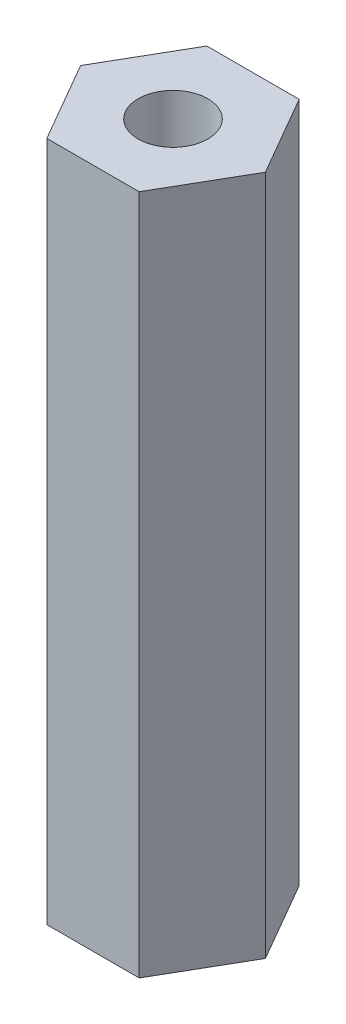
ISO-10303-21;
HEADER;
FILE_DESCRIPTION(('STEP AP214'),'2;1');
FILE_NAME('part.step','',(''),(''),'','','');
FILE_SCHEMA(('AUTOMOTIVE_DESIGN { 1 0 10303 214 1 1 1 1 }'));
ENDSEC;
DATA;
#1=APPLICATION_CONTEXT('core data for automotive mechanical design processes');
#2=APPLICATION_PROTOCOL_DEFINITION('international standard','automotive_design',2000,#1);
#3=PRODUCT_CONTEXT('',#1,'mechanical');
#4=PRODUCT('Part','Part','',(#3));
#5=PRODUCT_RELATED_PRODUCT_CATEGORY('part','',(#4));
#6=PRODUCT_DEFINITION_FORMATION('','',#4);
#7=PRODUCT_DEFINITION_CONTEXT('part definition',#1,'design');
#8=PRODUCT_DEFINITION('design','',#6,#7);
#9=PRODUCT_DEFINITION_SHAPE('','',#8);
#10=(LENGTH_UNIT() NAMED_UNIT(*) SI_UNIT(.MILLI.,.METRE.));
#11=(NAMED_UNIT(*) PLANE_ANGLE_UNIT() SI_UNIT($,.RADIAN.));
#12=(NAMED_UNIT(*) SI_UNIT($,.STERADIAN.) SOLID_ANGLE_UNIT());
#13=UNCERTAINTY_MEASURE_WITH_UNIT(LENGTH_MEASURE(1.E-05),#10,'distance_accuracy_value','');
#14=(GEOMETRIC_REPRESENTATION_CONTEXT(3) GLOBAL_UNCERTAINTY_ASSIGNED_CONTEXT((#13)) GLOBAL_UNIT_ASSIGNED_CONTEXT((#10,
#11,#12)) REPRESENTATION_CONTEXT('',''));
#15=CARTESIAN_POINT('',(0.,0.,0.));
#16=DIRECTION('',(0.,0.,1.));
#17=DIRECTION('',(1.,0.,0.));
#18=AXIS2_PLACEMENT_3D('',#15,#16,#17);
#19=CARTESIAN_POINT('',(-1.35677313259562,0.,2.35));
#20=DIRECTION('',(0.,0.,1.));
#21=DIRECTION('',(1.,0.,0.));
#22=AXIS2_PLACEMENT_3D('',#19,#20,#21);
#23=PLANE('',#22);
#24=DIRECTION('',(1.,0.,0.));
#25=VECTOR('',#24,1.);
#26=CARTESIAN_POINT('',(-1.35677313259562,20.,2.35));
#27=LINE('',#26,#25);
#28=CARTESIAN_POINT('',(-1.35677313259562,20.,2.35));
#29=VERTEX_POINT('',#28);
#30=CARTESIAN_POINT('',(1.35677313259562,20.,2.35));
#31=VERTEX_POINT('',#30);
#32=EDGE_CURVE('E118',#29,#31,#27,.T.);
#33=ORIENTED_EDGE('',*,*,#32,.F.);
#34=DIRECTION('',(0.,1.,0.));
#35=VECTOR('',#34,1.);
#36=CARTESIAN_POINT('',(-1.35677313259562,0.,2.35));
#37=LINE('',#36,#35);
#38=CARTESIAN_POINT('',(-1.35677313259562,0.,2.35));
#39=VERTEX_POINT('',#38);
#40=EDGE_CURVE('E11',#39,#29,#37,.T.);
#41=ORIENTED_EDGE('',*,*,#40,.F.);
#42=DIRECTION('',(1.,0.,0.));
#43=VECTOR('',#42,1.);
#44=CARTESIAN_POINT('',(-1.35677313259562,0.,2.35));
#45=LINE('',#44,#43);
#46=CARTESIAN_POINT('',(1.35677313259562,0.,2.35));
#47=VERTEX_POINT('',#46);
#48=EDGE_CURVE('E133',#39,#47,#45,.T.);
#49=ORIENTED_EDGE('',*,*,#48,.T.);
#50=DIRECTION('',(0.,1.,0.));
#51=VECTOR('',#50,1.);
#52=CARTESIAN_POINT('',(1.35677313259562,0.,2.35));
#53=LINE('',#52,#51);
#54=EDGE_CURVE('E36',#47,#31,#53,.T.);
#55=ORIENTED_EDGE('',*,*,#54,.T.);
#56=EDGE_LOOP('',(#33,#41,#49,#55));
#57=FACE_BOUND('',#56,.T.);
#58=ADVANCED_FACE('F33',(#57),#23,.T.);
#59=CARTESIAN_POINT('',(-2.71354626519124,0.,0.));
#60=DIRECTION('',(-0.866025403784439,0.,0.5));
#61=DIRECTION('',(0.5,0.,0.866025403784439));
#62=AXIS2_PLACEMENT_3D('',#59,#60,#61);
#63=PLANE('',#62);
#64=DIRECTION('',(0.5,0.,0.866025403784438));
#65=VECTOR('',#64,1.);
#66=CARTESIAN_POINT('',(-2.71354626519124,20.,0.));
#67=LINE('',#66,#65);
#68=CARTESIAN_POINT('',(-2.71354626519124,20.,0.));
#69=VERTEX_POINT('',#68);
#70=EDGE_CURVE('E131',#69,#29,#67,.T.);
#71=ORIENTED_EDGE('',*,*,#70,.F.);
#72=DIRECTION('',(0.,1.,0.));
#73=VECTOR('',#72,1.);
#74=CARTESIAN_POINT('',(-2.71354626519124,0.,0.));
#75=LINE('',#74,#73);
#76=CARTESIAN_POINT('',(-2.71354626519124,0.,0.));
#77=VERTEX_POINT('',#76);
#78=EDGE_CURVE('E42',#77,#69,#75,.T.);
#79=ORIENTED_EDGE('',*,*,#78,.F.);
#80=DIRECTION('',(0.5,0.,0.866025403784438));
#81=VECTOR('',#80,1.);
#82=CARTESIAN_POINT('',(-2.71354626519124,0.,0.));
#83=LINE('',#82,#81);
#84=EDGE_CURVE('E108',#77,#39,#83,.T.);
#85=ORIENTED_EDGE('',*,*,#84,.T.);
#86=ORIENTED_EDGE('',*,*,#40,.T.);
#87=EDGE_LOOP('',(#71,#79,#85,#86));
#88=FACE_BOUND('',#87,.T.);
#89=ADVANCED_FACE('F141',(#88),#63,.T.);
#90=CARTESIAN_POINT('',(-1.35677313259562,0.,-2.35));
#91=DIRECTION('',(-0.866025403784438,0.,-0.5));
#92=DIRECTION('',(-0.5,0.,0.866025403784438));
#93=AXIS2_PLACEMENT_3D('',#90,#91,#92);
#94=PLANE('',#93);
#95=DIRECTION('',(-0.5,0.,0.866025403784438));
#96=VECTOR('',#95,1.);
#97=CARTESIAN_POINT('',(-1.35677313259562,20.,-2.35));
#98=LINE('',#97,#96);
#99=CARTESIAN_POINT('',(-1.35677313259562,20.,-2.35));
#100=VERTEX_POINT('',#99);
#101=EDGE_CURVE('E95',#100,#69,#98,.T.);
#102=ORIENTED_EDGE('',*,*,#101,.F.);
#103=DIRECTION('',(0.,1.,0.));
#104=VECTOR('',#103,1.);
#105=CARTESIAN_POINT('',(-1.35677313259562,0.,-2.35));
#106=LINE('',#105,#104);
#107=CARTESIAN_POINT('',(-1.35677313259562,0.,-2.35));
#108=VERTEX_POINT('',#107);
#109=EDGE_CURVE('E90',#108,#100,#106,.T.);
#110=ORIENTED_EDGE('',*,*,#109,.F.);
#111=DIRECTION('',(-0.5,0.,0.866025403784438));
#112=VECTOR('',#111,1.);
#113=CARTESIAN_POINT('',(-1.35677313259562,0.,-2.35));
#114=LINE('',#113,#112);
#115=EDGE_CURVE('E93',#108,#77,#114,.T.);
#116=ORIENTED_EDGE('',*,*,#115,.T.);
#117=ORIENTED_EDGE('',*,*,#78,.T.);
#118=EDGE_LOOP('',(#102,#110,#116,#117));
#119=FACE_BOUND('',#118,.T.);
#120=ADVANCED_FACE('F92',(#119),#94,.T.);
#121=CARTESIAN_POINT('',(1.35677313259562,0.,-2.35));
#122=DIRECTION('',(0.,0.,-1.));
#123=DIRECTION('',(-1.,0.,0.));
#124=AXIS2_PLACEMENT_3D('',#121,#122,#123);
#125=PLANE('',#124);
#126=DIRECTION('',(-1.,0.,0.));
#127=VECTOR('',#126,1.);
#128=CARTESIAN_POINT('',(1.35677313259562,20.,-2.35));
#129=LINE('',#128,#127);
#130=CARTESIAN_POINT('',(1.35677313259562,20.,-2.35));
#131=VERTEX_POINT('',#130);
#132=EDGE_CURVE('E128',#131,#100,#129,.T.);
#133=ORIENTED_EDGE('',*,*,#132,.F.);
#134=DIRECTION('',(0.,1.,0.));
#135=VECTOR('',#134,1.);
#136=CARTESIAN_POINT('',(1.35677313259562,0.,-2.35));
#137=LINE('',#136,#135);
#138=CARTESIAN_POINT('',(1.35677313259562,0.,-2.35));
#139=VERTEX_POINT('',#138);
#140=EDGE_CURVE('E100',#139,#131,#137,.T.);
#141=ORIENTED_EDGE('',*,*,#140,.F.);
#142=DIRECTION('',(-1.,0.,0.));
#143=VECTOR('',#142,1.);
#144=CARTESIAN_POINT('',(1.35677313259562,0.,-2.35));
#145=LINE('',#144,#143);
#146=EDGE_CURVE('E106',#139,#108,#145,.T.);
#147=ORIENTED_EDGE('',*,*,#146,.T.);
#148=ORIENTED_EDGE('',*,*,#109,.T.);
#149=EDGE_LOOP('',(#133,#141,#147,#148));
#150=FACE_BOUND('',#149,.T.);
#151=ADVANCED_FACE('F110',(#150),#125,.T.);
#152=CARTESIAN_POINT('',(2.71354626519124,0.,0.));
#153=DIRECTION('',(0.866025403784438,0.,-0.5));
#154=DIRECTION('',(-0.5,0.,-0.866025403784439));
#155=AXIS2_PLACEMENT_3D('',#152,#153,#154);
#156=PLANE('',#155);
#157=DIRECTION('',(-0.5,0.,-0.866025403784438));
#158=VECTOR('',#157,1.);
#159=CARTESIAN_POINT('',(2.71354626519124,20.,0.));
#160=LINE('',#159,#158);
#161=CARTESIAN_POINT('',(2.71354626519124,20.,0.));
#162=VERTEX_POINT('',#161);
#163=EDGE_CURVE('E125',#162,#131,#160,.T.);
#164=ORIENTED_EDGE('',*,*,#163,.F.);
#165=DIRECTION('',(0.,1.,0.));
#166=VECTOR('',#165,1.);
#167=CARTESIAN_POINT('',(2.71354626519124,0.,0.));
#168=LINE('',#167,#166);
#169=CARTESIAN_POINT('',(2.71354626519124,0.,0.));
#170=VERTEX_POINT('',#169);
#171=EDGE_CURVE('E136',#170,#162,#168,.T.);
#172=ORIENTED_EDGE('',*,*,#171,.F.);
#173=DIRECTION('',(-0.5,0.,-0.866025403784438));
#174=VECTOR('',#173,1.);
#175=CARTESIAN_POINT('',(2.71354626519124,0.,0.));
#176=LINE('',#175,#174);
#177=EDGE_CURVE('E111',#170,#139,#176,.T.);
#178=ORIENTED_EDGE('',*,*,#177,.T.);
#179=ORIENTED_EDGE('',*,*,#140,.T.);
#180=EDGE_LOOP('',(#164,#172,#178,#179));
#181=FACE_BOUND('',#180,.T.);
#182=ADVANCED_FACE('F154',(#181),#156,.T.);
#183=CARTESIAN_POINT('',(1.35677313259562,0.,2.35));
#184=DIRECTION('',(0.866025403784438,0.,0.5));
#185=DIRECTION('',(0.5,0.,-0.866025403784438));
#186=AXIS2_PLACEMENT_3D('',#183,#184,#185);
#187=PLANE('',#186);
#188=DIRECTION('',(0.5,0.,-0.866025403784438));
#189=VECTOR('',#188,1.);
#190=CARTESIAN_POINT('',(1.35677313259562,20.,2.35));
#191=LINE('',#190,#189);
#192=EDGE_CURVE('E121',#31,#162,#191,.T.);
#193=ORIENTED_EDGE('',*,*,#192,.F.);
#194=ORIENTED_EDGE('',*,*,#54,.F.);
#195=DIRECTION('',(0.5,0.,-0.866025403784438));
#196=VECTOR('',#195,1.);
#197=CARTESIAN_POINT('',(1.35677313259562,0.,2.35));
#198=LINE('',#197,#196);
#199=EDGE_CURVE('E113',#47,#170,#198,.T.);
#200=ORIENTED_EDGE('',*,*,#199,.T.);
#201=ORIENTED_EDGE('',*,*,#171,.T.);
#202=EDGE_LOOP('',(#193,#194,#200,#201));
#203=FACE_BOUND('',#202,.T.);
#204=ADVANCED_FACE('F138',(#203),#187,.T.);
#205=CARTESIAN_POINT('',(0.,0.,0.));
#206=DIRECTION('',(0.,1.,0.));
#207=DIRECTION('',(0.,0.,1.));
#208=AXIS2_PLACEMENT_3D('',#205,#206,#207);
#209=PLANE('',#208);
#210=CARTESIAN_POINT('',(0.,0.,0.));
#211=DIRECTION('',(0.,1.,0.));
#212=DIRECTION('',(0.,0.,1.));
#213=AXIS2_PLACEMENT_3D('',#210,#211,#212);
#214=CIRCLE('',#213,1.025);
#215=CARTESIAN_POINT('',(0.,0.,1.025));
#216=VERTEX_POINT('',#215);
#217=EDGE_CURVE('E122',#216,#216,#214,.T.);
#218=ORIENTED_EDGE('',*,*,#217,.T.);
#219=EDGE_LOOP('',(#218));
#220=FACE_BOUND('',#219,.T.);
#221=ORIENTED_EDGE('',*,*,#48,.F.);
#222=ORIENTED_EDGE('',*,*,#84,.F.);
#223=ORIENTED_EDGE('',*,*,#115,.F.);
#224=ORIENTED_EDGE('',*,*,#146,.F.);
#225=ORIENTED_EDGE('',*,*,#177,.F.);
#226=ORIENTED_EDGE('',*,*,#199,.F.);
#227=EDGE_LOOP('',(#221,#222,#223,#224,#225,#226));
#228=FACE_BOUND('',#227,.T.);
#229=ADVANCED_FACE('F104',(#220,#228),#209,.F.);
#230=CARTESIAN_POINT('',(0.,20.,0.));
#231=DIRECTION('',(0.,1.,0.));
#232=DIRECTION('',(0.,0.,1.));
#233=AXIS2_PLACEMENT_3D('',#230,#231,#232);
#234=PLANE('',#233);
#235=CARTESIAN_POINT('',(0.,20.,0.));
#236=DIRECTION('',(0.,1.,0.));
#237=DIRECTION('',(0.,0.,1.));
#238=AXIS2_PLACEMENT_3D('',#235,#236,#237);
#239=CIRCLE('',#238,1.025);
#240=CARTESIAN_POINT('',(0.,20.,1.025));
#241=VERTEX_POINT('',#240);
#242=EDGE_CURVE('E176',#241,#241,#239,.T.);
#243=ORIENTED_EDGE('',*,*,#242,.F.);
#244=EDGE_LOOP('',(#243));
#245=FACE_BOUND('',#244,.T.);
#246=ORIENTED_EDGE('',*,*,#32,.T.);
#247=ORIENTED_EDGE('',*,*,#192,.T.);
#248=ORIENTED_EDGE('',*,*,#163,.T.);
#249=ORIENTED_EDGE('',*,*,#132,.T.);
#250=ORIENTED_EDGE('',*,*,#101,.T.);
#251=ORIENTED_EDGE('',*,*,#70,.T.);
#252=EDGE_LOOP('',(#246,#247,#248,#249,#250,#251));
#253=FACE_BOUND('',#252,.T.);
#254=ADVANCED_FACE('F140',(#245,#253),#234,.T.);
#255=CARTESIAN_POINT('',(0.,20.,0.));
#256=DIRECTION('',(0.,1.,0.));
#257=DIRECTION('',(0.,0.,1.));
#258=AXIS2_PLACEMENT_3D('',#255,#256,#257);
#259=CYLINDRICAL_SURFACE('',#258,1.025);
#260=ORIENTED_EDGE('',*,*,#242,.T.);
#261=EDGE_LOOP('',(#260));
#262=FACE_BOUND('',#261,.T.);
#263=ORIENTED_EDGE('',*,*,#217,.F.);
#264=EDGE_LOOP('',(#263));
#265=FACE_BOUND('',#264,.T.);
#266=ADVANCED_FACE('F165',(#262,#265),#259,.F.);
#267=CLOSED_SHELL('',(#58,#89,#120,#151,#182,#204,#229,#254,#266));
#268=MANIFOLD_SOLID_BREP('B2',#267);
#269=ADVANCED_BREP_SHAPE_REPRESENTATION('',(#18,#268),#14);
#270=SHAPE_DEFINITION_REPRESENTATION(#9,#269);
ENDSEC;
END-ISO-10303-21;
